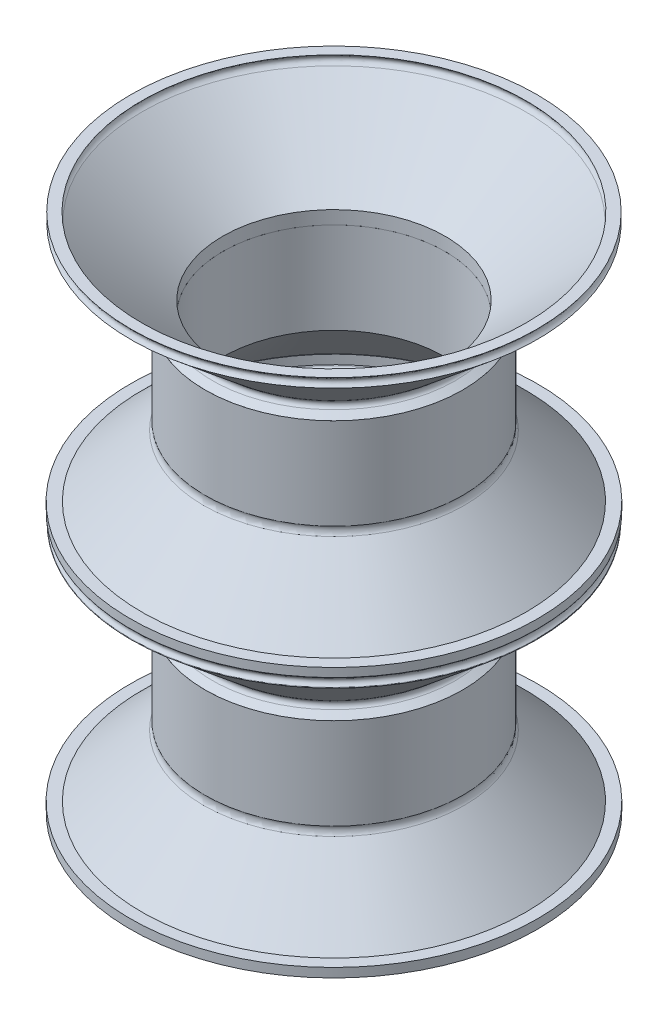
ISO-10303-21;
HEADER;
FILE_DESCRIPTION(('STEP AP214'),'2;1');
FILE_NAME('part.step','',(''),(''),'','','');
FILE_SCHEMA(('AUTOMOTIVE_DESIGN { 1 0 10303 214 1 1 1 1 }'));
ENDSEC;
DATA;
#1=APPLICATION_CONTEXT('core data for automotive mechanical design processes');
#2=APPLICATION_PROTOCOL_DEFINITION('international standard','automotive_design',2000,#1);
#3=PRODUCT_CONTEXT('',#1,'mechanical');
#4=PRODUCT('Part','Part','',(#3));
#5=PRODUCT_RELATED_PRODUCT_CATEGORY('part','',(#4));
#6=PRODUCT_DEFINITION_FORMATION('','',#4);
#7=PRODUCT_DEFINITION_CONTEXT('part definition',#1,'design');
#8=PRODUCT_DEFINITION('design','',#6,#7);
#9=PRODUCT_DEFINITION_SHAPE('','',#8);
#10=(LENGTH_UNIT() NAMED_UNIT(*) SI_UNIT(.MILLI.,.METRE.));
#11=(NAMED_UNIT(*) PLANE_ANGLE_UNIT() SI_UNIT($,.RADIAN.));
#12=(NAMED_UNIT(*) SI_UNIT($,.STERADIAN.) SOLID_ANGLE_UNIT());
#13=UNCERTAINTY_MEASURE_WITH_UNIT(LENGTH_MEASURE(1.E-05),#10,'distance_accuracy_value','');
#14=(GEOMETRIC_REPRESENTATION_CONTEXT(3) GLOBAL_UNCERTAINTY_ASSIGNED_CONTEXT((#13)) GLOBAL_UNIT_ASSIGNED_CONTEXT((#10,
#11,#12)) REPRESENTATION_CONTEXT('',''));
#15=CARTESIAN_POINT('',(0.,0.,0.));
#16=DIRECTION('',(0.,0.,1.));
#17=DIRECTION('',(1.,0.,0.));
#18=AXIS2_PLACEMENT_3D('',#15,#16,#17);
#19=CARTESIAN_POINT('',(12.266246150267,28.45,0.));
#20=DIRECTION('',(0.,-1.,0.));
#21=DIRECTION('',(1.,0.,0.));
#22=AXIS2_PLACEMENT_3D('',#19,#20,#21);
#23=CONICAL_SURFACE('',#22,12.7105503207346,1.02390555454664);
#24=CARTESIAN_POINT('',(12.266246150267,28.0877114557299,0.));
#25=DIRECTION('',(0.,-1.,0.));
#26=DIRECTION('',(1.,0.,0.));
#27=AXIS2_PLACEMENT_3D('',#24,#25,#26);
#28=CIRCLE('',#27,13.3056020683309);
#29=CARTESIAN_POINT('',(25.5718482185979,28.0877114557299,0.));
#30=VERTEX_POINT('',#29);
#31=EDGE_CURVE('E11',#30,#30,#28,.T.);
#32=ORIENTED_EDGE('',*,*,#31,.T.);
#33=EDGE_LOOP('',(#32));
#34=FACE_BOUND('',#33,.T.);
#35=CARTESIAN_POINT('',(12.266246150267,27.6018152658715,0.));
#36=DIRECTION('',(0.,1.,0.));
#37=DIRECTION('',(-1.,0.,0.));
#38=AXIS2_PLACEMENT_3D('',#35,#36,#37);
#39=CIRCLE('',#38,14.1036769219207);
#40=CARTESIAN_POINT('',(-1.83743077165368,27.6018152658715,0.));
#41=VERTEX_POINT('',#40);
#42=EDGE_CURVE('E75',#41,#41,#39,.T.);
#43=ORIENTED_EDGE('',*,*,#42,.T.);
#44=EDGE_LOOP('',(#43));
#45=FACE_BOUND('',#44,.T.);
#46=ADVANCED_FACE('F52',(#34,#45),#23,.T.);
#47=CARTESIAN_POINT('',(12.266246150267,36.45,0.));
#48=DIRECTION('',(0.,1.,0.));
#49=DIRECTION('',(-1.,0.,0.));
#50=AXIS2_PLACEMENT_3D('',#47,#48,#49);
#51=CONICAL_SURFACE('',#50,22.2445790614883,0.87266462599717);
#52=CARTESIAN_POINT('',(12.266246150267,28.8978064534284,0.));
#53=DIRECTION('',(0.,1.,0.));
#54=DIRECTION('',(-1.,0.,0.));
#55=AXIS2_PLACEMENT_3D('',#52,#53,#54);
#56=CIRCLE('',#55,13.2442252703947);
#57=CARTESIAN_POINT('',(-0.977979120127719,28.8978064534284,0.));
#58=VERTEX_POINT('',#57);
#59=EDGE_CURVE('E59',#58,#58,#56,.T.);
#60=ORIENTED_EDGE('',*,*,#59,.T.);
#61=EDGE_LOOP('',(#60));
#62=FACE_BOUND('',#61,.T.);
#63=CARTESIAN_POINT('',(12.266246150267,36.45,0.));
#64=DIRECTION('',(0.,1.,0.));
#65=DIRECTION('',(-1.,0.,0.));
#66=AXIS2_PLACEMENT_3D('',#63,#64,#65);
#67=CIRCLE('',#66,22.2445790614883);
#68=CARTESIAN_POINT('',(-9.97833291122136,36.45,0.));
#69=VERTEX_POINT('',#68);
#70=EDGE_CURVE('E63',#69,#69,#67,.T.);
#71=ORIENTED_EDGE('',*,*,#70,.F.);
#72=EDGE_LOOP('',(#71));
#73=FACE_BOUND('',#72,.T.);
#74=ADVANCED_FACE('F121',(#62,#73),#51,.T.);
#75=CARTESIAN_POINT('',(12.266246150267,29.0497502558786,0.));
#76=DIRECTION('',(0.,1.,0.));
#77=DIRECTION('',(-1.,0.,0.));
#78=AXIS2_PLACEMENT_3D('',#75,#76,#77);
#79=CONICAL_SURFACE('',#78,12.1807257813488,0.87266462599717);
#80=CARTESIAN_POINT('',(12.266246150267,36.45,0.));
#81=DIRECTION('',(0.,-1.,0.));
#82=DIRECTION('',(1.,0.,0.));
#83=AXIS2_PLACEMENT_3D('',#80,#81,#82);
#84=CIRCLE('',#83,21.);
#85=CARTESIAN_POINT('',(33.266246150267,36.45,0.));
#86=VERTEX_POINT('',#85);
#87=EDGE_CURVE('E84',#86,#86,#84,.T.);
#88=ORIENTED_EDGE('',*,*,#87,.F.);
#89=EDGE_LOOP('',(#88));
#90=FACE_BOUND('',#89,.T.);
#91=CARTESIAN_POINT('',(12.266246150267,29.0497502558786,0.));
#92=DIRECTION('',(0.,1.,0.));
#93=DIRECTION('',(-1.,0.,0.));
#94=AXIS2_PLACEMENT_3D('',#91,#92,#93);
#95=CIRCLE('',#94,12.1807257813488);
#96=CARTESIAN_POINT('',(0.0855203689181672,29.0497502558786,0.));
#97=VERTEX_POINT('',#96);
#98=EDGE_CURVE('E67',#97,#97,#95,.T.);
#99=ORIENTED_EDGE('',*,*,#98,.F.);
#100=EDGE_LOOP('',(#99));
#101=FACE_BOUND('',#100,.T.);
#102=ADVANCED_FACE('F117',(#90,#101),#79,.F.);
#103=CARTESIAN_POINT('',(12.266246150267,36.0590180328199,0.));
#104=DIRECTION('',(0.,1.,0.));
#105=DIRECTION('',(-1.,0.,0.));
#106=AXIS2_PLACEMENT_3D('',#103,#104,#105);
#107=CYLINDRICAL_SURFACE('',#106,12.1807257813488);
#108=ORIENTED_EDGE('',*,*,#98,.T.);
#109=EDGE_LOOP('',(#108));
#110=FACE_BOUND('',#109,.T.);
#111=CARTESIAN_POINT('',(12.266246150267,27.6018152658715,0.));
#112=DIRECTION('',(0.,1.,0.));
#113=DIRECTION('',(-1.,0.,0.));
#114=AXIS2_PLACEMENT_3D('',#111,#112,#113);
#115=CIRCLE('',#114,12.1807257813488);
#116=CARTESIAN_POINT('',(0.0855203689181672,27.6018152658715,0.));
#117=VERTEX_POINT('',#116);
#118=EDGE_CURVE('E72',#117,#117,#115,.T.);
#119=ORIENTED_EDGE('',*,*,#118,.F.);
#120=EDGE_LOOP('',(#119));
#121=FACE_BOUND('',#120,.T.);
#122=ADVANCED_FACE('F113',(#110,#121),#107,.F.);
#123=CARTESIAN_POINT('',(0.0855203689181681,27.6018152658715,0.));
#124=DIRECTION('',(0.,-1.,0.));
#125=DIRECTION('',(1.,0.,0.));
#126=AXIS2_PLACEMENT_3D('',#123,#124,#125);
#127=PLANE('',#126);
#128=ORIENTED_EDGE('',*,*,#118,.T.);
#129=EDGE_LOOP('',(#128));
#130=FACE_BOUND('',#129,.T.);
#131=ORIENTED_EDGE('',*,*,#42,.F.);
#132=EDGE_LOOP('',(#131));
#133=FACE_BOUND('',#132,.T.);
#134=ADVANCED_FACE('F110',(#130,#133),#127,.T.);
#135=CARTESIAN_POINT('',(12.266246150267,28.5147842318689,0.));
#136=DIRECTION('',(0.,1.,0.));
#137=DIRECTION('',(-1.,0.,0.));
#138=AXIS2_PLACEMENT_3D('',#135,#136,#137);
#139=TOROIDAL_SURFACE('',#138,13.565619075238,0.5);
#140=ORIENTED_EDGE('',*,*,#31,.F.);
#141=EDGE_LOOP('',(#140));
#142=FACE_BOUND('',#141,.T.);
#143=ORIENTED_EDGE('',*,*,#59,.F.);
#144=EDGE_LOOP('',(#143));
#145=FACE_BOUND('',#144,.T.);
#146=ADVANCED_FACE('F54',(#142,#145),#139,.F.);
#147=CARTESIAN_POINT('',(-8.73375384973302,36.45,0.));
#148=CARTESIAN_POINT('',(-9.41713424360817,36.9047580248928,0.));
#149=CARTESIAN_POINT('',(-8.79657882871846,37.45,0.));
#150=B_SPLINE_CURVE_WITH_KNOTS('',2,(#147,#148,#149),.UNSPECIFIED.,.F.,.F.,(3,3),(0.,1.),.UNSPECIFIED.);
#151=CARTESIAN_POINT('',(12.266246150267,8.48015566974782,0.));
#152=DIRECTION('',(0.,-1.,0.));
#153=AXIS1_PLACEMENT('',#151,#152);
#154=SURFACE_OF_REVOLUTION('',#150,#153);
#155=CARTESIAN_POINT('',(12.266246150267,37.45,0.));
#156=DIRECTION('',(0.,-1.,0.));
#157=DIRECTION('',(1.,0.,0.));
#158=AXIS2_PLACEMENT_3D('',#155,#156,#157);
#159=CIRCLE('',#158,21.0628249789854);
#160=CARTESIAN_POINT('',(33.3290711292524,37.45,0.));
#161=VERTEX_POINT('',#160);
#162=EDGE_CURVE('E78',#161,#161,#159,.T.);
#163=ORIENTED_EDGE('',*,*,#162,.F.);
#164=EDGE_LOOP('',(#163));
#165=FACE_BOUND('',#164,.T.);
#166=ORIENTED_EDGE('',*,*,#87,.T.);
#167=EDGE_LOOP('',(#166));
#168=FACE_BOUND('',#167,.T.);
#169=ADVANCED_FACE('F105',(#165,#168),#154,.T.);
#170=CARTESIAN_POINT('',(-8.79657882871846,37.45,0.));
#171=DIRECTION('',(0.,-1.,0.));
#172=DIRECTION('',(1.,0.,0.));
#173=AXIS2_PLACEMENT_3D('',#170,#171,#172);
#174=PLANE('',#173);
#175=CARTESIAN_POINT('',(12.266246150267,37.45,0.));
#176=DIRECTION('',(0.,-1.,0.));
#177=DIRECTION('',(1.,0.,0.));
#178=AXIS2_PLACEMENT_3D('',#175,#176,#177);
#179=CIRCLE('',#178,22.2445790614883);
#180=CARTESIAN_POINT('',(34.5108252117553,37.45,0.));
#181=VERTEX_POINT('',#180);
#182=EDGE_CURVE('E81',#181,#181,#179,.T.);
#183=ORIENTED_EDGE('',*,*,#182,.F.);
#184=EDGE_LOOP('',(#183));
#185=FACE_BOUND('',#184,.T.);
#186=ORIENTED_EDGE('',*,*,#162,.T.);
#187=EDGE_LOOP('',(#186));
#188=FACE_BOUND('',#187,.T.);
#189=ADVANCED_FACE('F101',(#185,#188),#174,.F.);
#190=CARTESIAN_POINT('',(-9.97833291122136,37.45,0.));
#191=CARTESIAN_POINT('',(-9.32229251414753,36.9333569168223,0.));
#192=CARTESIAN_POINT('',(-9.97833291122136,36.45,0.));
#193=B_SPLINE_CURVE_WITH_KNOTS('',2,(#190,#191,#192),.UNSPECIFIED.,.F.,.F.,(3,3),(0.,1.),.UNSPECIFIED.);
#194=CARTESIAN_POINT('',(12.266246150267,8.48015566974782,0.));
#195=DIRECTION('',(0.,-1.,0.));
#196=AXIS1_PLACEMENT('',#194,#195);
#197=SURFACE_OF_REVOLUTION('',#193,#196);
#198=ORIENTED_EDGE('',*,*,#70,.T.);
#199=EDGE_LOOP('',(#198));
#200=FACE_BOUND('',#199,.T.);
#201=ORIENTED_EDGE('',*,*,#182,.T.);
#202=EDGE_LOOP('',(#201));
#203=FACE_BOUND('',#202,.T.);
#204=ADVANCED_FACE('F98',(#200,#203),#197,.T.);
#205=CLOSED_SHELL('',(#46,#74,#102,#122,#134,#146,#169,#189,#204));
#206=MANIFOLD_SOLID_BREP('B2',#205);
#207=CARTESIAN_POINT('',(12.266246150267,27.6018152658715,0.));
#208=DIRECTION('',(0.,-1.,0.));
#209=DIRECTION('',(1.,0.,0.));
#210=AXIS2_PLACEMENT_3D('',#207,#208,#209);
#211=PLANE('',#210);
#212=CARTESIAN_POINT('',(12.266246150267,27.6018152658715,0.));
#213=DIRECTION('',(0.,-1.,0.));
#214=DIRECTION('',(1.,0.,0.));
#215=AXIS2_PLACEMENT_3D('',#212,#213,#214);
#216=CIRCLE('',#215,14.1036769219207);
#217=CARTESIAN_POINT('',(26.3699230721876,27.6018152658715,0.));
#218=VERTEX_POINT('',#217);
#219=EDGE_CURVE('E229',#218,#218,#216,.T.);
#220=ORIENTED_EDGE('',*,*,#219,.F.);
#221=EDGE_LOOP('',(#220));
#222=FACE_BOUND('',#221,.T.);
#223=CARTESIAN_POINT('',(12.266246150267,27.6018152658715,0.));
#224=DIRECTION('',(0.,-1.,0.));
#225=DIRECTION('',(1.,0.,0.));
#226=AXIS2_PLACEMENT_3D('',#223,#224,#225);
#227=CIRCLE('',#226,12.1807257813488);
#228=CARTESIAN_POINT('',(24.4469719316158,27.6018152658715,0.));
#229=VERTEX_POINT('',#228);
#230=EDGE_CURVE('E232',#229,#229,#227,.T.);
#231=ORIENTED_EDGE('',*,*,#230,.T.);
#232=EDGE_LOOP('',(#231));
#233=FACE_BOUND('',#232,.T.);
#234=ADVANCED_FACE('F211',(#222,#233),#211,.F.);
#235=CARTESIAN_POINT('',(12.266246150267,17.6018152658715,0.));
#236=DIRECTION('',(0.,1.,0.));
#237=DIRECTION('',(-1.,0.,0.));
#238=AXIS2_PLACEMENT_3D('',#235,#236,#237);
#239=CYLINDRICAL_SURFACE('',#238,14.1036769219207);
#240=CARTESIAN_POINT('',(12.266246150267,17.6018152658715,0.));
#241=DIRECTION('',(0.,-1.,0.));
#242=DIRECTION('',(1.,0.,0.));
#243=AXIS2_PLACEMENT_3D('',#240,#241,#242);
#244=CIRCLE('',#243,14.1036769219207);
#245=CARTESIAN_POINT('',(26.3699230721876,17.6018152658715,0.));
#246=VERTEX_POINT('',#245);
#247=EDGE_CURVE('E226',#246,#246,#244,.T.);
#248=ORIENTED_EDGE('',*,*,#247,.F.);
#249=EDGE_LOOP('',(#248));
#250=FACE_BOUND('',#249,.T.);
#251=ORIENTED_EDGE('',*,*,#219,.T.);
#252=EDGE_LOOP('',(#251));
#253=FACE_BOUND('',#252,.T.);
#254=ADVANCED_FACE('F277',(#250,#253),#239,.T.);
#255=CARTESIAN_POINT('',(12.266246150267,17.6018152658715,0.));
#256=DIRECTION('',(0.,1.,0.));
#257=DIRECTION('',(-1.,0.,0.));
#258=AXIS2_PLACEMENT_3D('',#255,#256,#257);
#259=CYLINDRICAL_SURFACE('',#258,12.1807257813488);
#260=CARTESIAN_POINT('',(12.266246150267,17.6018152658715,0.));
#261=DIRECTION('',(0.,-1.,0.));
#262=DIRECTION('',(1.,0.,0.));
#263=AXIS2_PLACEMENT_3D('',#260,#261,#262);
#264=CIRCLE('',#263,12.1807257813488);
#265=CARTESIAN_POINT('',(24.4469719316158,17.6018152658715,0.));
#266=VERTEX_POINT('',#265);
#267=EDGE_CURVE('E240',#266,#266,#264,.T.);
#268=ORIENTED_EDGE('',*,*,#267,.T.);
#269=EDGE_LOOP('',(#268));
#270=FACE_BOUND('',#269,.T.);
#271=ORIENTED_EDGE('',*,*,#230,.F.);
#272=EDGE_LOOP('',(#271));
#273=FACE_BOUND('',#272,.T.);
#274=ADVANCED_FACE('F283',(#270,#273),#259,.F.);
#275=CARTESIAN_POINT('',(12.266246150267,17.6018152658715,0.));
#276=DIRECTION('',(0.,-1.,0.));
#277=DIRECTION('',(1.,0.,0.));
#278=AXIS2_PLACEMENT_3D('',#275,#276,#277);
#279=CONICAL_SURFACE('',#278,13.4252337162371,0.785398163397447);
#280=CARTESIAN_POINT('',(12.266246150267,16.7442172194325,0.));
#281=DIRECTION('',(0.,1.,0.));
#282=DIRECTION('',(-1.,0.,0.));
#283=AXIS2_PLACEMENT_3D('',#280,#281,#282);
#284=CIRCLE('',#283,14.2828317626761);
#285=CARTESIAN_POINT('',(-2.01658561240909,16.7442172194325,0.));
#286=VERTEX_POINT('',#285);
#287=EDGE_CURVE('E222',#286,#286,#284,.F.);
#288=ORIENTED_EDGE('',*,*,#287,.T.);
#289=EDGE_LOOP('',(#288));
#290=FACE_BOUND('',#289,.T.);
#291=CARTESIAN_POINT('',(12.266246150267,9.99443833530415,0.));
#292=DIRECTION('',(0.,-1.,0.));
#293=DIRECTION('',(1.,0.,0.));
#294=AXIS2_PLACEMENT_3D('',#291,#292,#293);
#295=CIRCLE('',#294,21.0326106468044);
#296=CARTESIAN_POINT('',(33.2988567970714,9.99443833530415,0.));
#297=VERTEX_POINT('',#296);
#298=EDGE_CURVE('E237',#297,#297,#295,.T.);
#299=ORIENTED_EDGE('',*,*,#298,.F.);
#300=EDGE_LOOP('',(#299));
#301=FACE_BOUND('',#300,.T.);
#302=ADVANCED_FACE('F296',(#290,#301),#279,.T.);
#303=CARTESIAN_POINT('',(12.266246150267,9.99443833530414,0.));
#304=DIRECTION('',(0.,-1.,0.));
#305=DIRECTION('',(1.,0.,0.));
#306=AXIS2_PLACEMENT_3D('',#303,#304,#305);
#307=CONICAL_SURFACE('',#306,19.7881027119161,0.785398163397446);
#308=ORIENTED_EDGE('',*,*,#267,.F.);
#309=EDGE_LOOP('',(#308));
#310=FACE_BOUND('',#309,.T.);
#311=CARTESIAN_POINT('',(12.266246150267,9.99443833530414,0.));
#312=DIRECTION('',(0.,-1.,0.));
#313=DIRECTION('',(1.,0.,0.));
#314=AXIS2_PLACEMENT_3D('',#311,#312,#313);
#315=CIRCLE('',#314,19.7881027119161);
#316=CARTESIAN_POINT('',(32.0543488621831,9.99443833530415,0.));
#317=VERTEX_POINT('',#316);
#318=EDGE_CURVE('E241',#317,#317,#315,.T.);
#319=ORIENTED_EDGE('',*,*,#318,.T.);
#320=EDGE_LOOP('',(#319));
#321=FACE_BOUND('',#320,.T.);
#322=ADVANCED_FACE('F291',(#310,#321),#307,.F.);
#323=CARTESIAN_POINT('',(12.266246150267,17.3099026443818,0.));
#324=DIRECTION('',(0.,1.,0.));
#325=DIRECTION('',(-1.,0.,0.));
#326=AXIS2_PLACEMENT_3D('',#323,#324,#325);
#327=TOROIDAL_SURFACE('',#326,14.8485171876253,0.8);
#328=ORIENTED_EDGE('',*,*,#247,.T.);
#329=EDGE_LOOP('',(#328));
#330=FACE_BOUND('',#329,.T.);
#331=ORIENTED_EDGE('',*,*,#287,.F.);
#332=EDGE_LOOP('',(#331));
#333=FACE_BOUND('',#332,.T.);
#334=ADVANCED_FACE('F273',(#330,#333),#327,.F.);
#335=CARTESIAN_POINT('',(12.266246150267,9.99443833530414,0.));
#336=DIRECTION('',(0.,-1.,0.));
#337=DIRECTION('',(1.,0.,0.));
#338=AXIS2_PLACEMENT_3D('',#335,#336,#337);
#339=PLANE('',#338);
#340=CARTESIAN_POINT('',(12.266246150267,9.99443833530414,0.));
#341=DIRECTION('',(0.,-1.,0.));
#342=DIRECTION('',(1.,0.,0.));
#343=AXIS2_PLACEMENT_3D('',#340,#341,#342);
#344=CIRCLE('',#343,19.7381027119161);
#345=CARTESIAN_POINT('',(32.0043488621831,9.99443833530415,0.));
#346=VERTEX_POINT('',#345);
#347=EDGE_CURVE('E250',#346,#346,#344,.T.);
#348=ORIENTED_EDGE('',*,*,#347,.T.);
#349=EDGE_LOOP('',(#348));
#350=FACE_BOUND('',#349,.T.);
#351=ORIENTED_EDGE('',*,*,#318,.F.);
#352=EDGE_LOOP('',(#351));
#353=FACE_BOUND('',#352,.T.);
#354=ADVANCED_FACE('F262',(#350,#353),#339,.F.);
#355=CARTESIAN_POINT('',(12.266246150267,8.99443833530414,0.));
#356=DIRECTION('',(0.,-1.,0.));
#357=DIRECTION('',(1.,0.,0.));
#358=AXIS2_PLACEMENT_3D('',#355,#356,#357);
#359=PLANE('',#358);
#360=CARTESIAN_POINT('',(12.266246150267,8.99443833530414,0.));
#361=DIRECTION('',(0.,-1.,0.));
#362=DIRECTION('',(1.,0.,0.));
#363=AXIS2_PLACEMENT_3D('',#360,#361,#362);
#364=CIRCLE('',#363,22.2445790614883);
#365=CARTESIAN_POINT('',(34.5108252117553,8.99443833530415,0.));
#366=VERTEX_POINT('',#365);
#367=EDGE_CURVE('E218',#366,#366,#364,.T.);
#368=ORIENTED_EDGE('',*,*,#367,.T.);
#369=EDGE_LOOP('',(#368));
#370=FACE_BOUND('',#369,.T.);
#371=CARTESIAN_POINT('',(12.266246150267,8.99443833530414,0.));
#372=DIRECTION('',(0.,-1.,0.));
#373=DIRECTION('',(1.,0.,0.));
#374=AXIS2_PLACEMENT_3D('',#371,#372,#373);
#375=CIRCLE('',#374,19.7381027119161);
#376=CARTESIAN_POINT('',(32.0043488621831,8.99443833530414,0.));
#377=VERTEX_POINT('',#376);
#378=EDGE_CURVE('E249',#377,#377,#375,.T.);
#379=ORIENTED_EDGE('',*,*,#378,.F.);
#380=EDGE_LOOP('',(#379));
#381=FACE_BOUND('',#380,.T.);
#382=ADVANCED_FACE('F259',(#370,#381),#359,.T.);
#383=ORIENTED_EDGE('',*,*,#298,.T.);
#384=EDGE_LOOP('',(#383));
#385=FACE_BOUND('',#384,.T.);
#386=CARTESIAN_POINT('',(12.266246150267,9.99443833530414,0.));
#387=DIRECTION('',(0.,-1.,0.));
#388=DIRECTION('',(1.,0.,0.));
#389=AXIS2_PLACEMENT_3D('',#386,#387,#388);
#390=CIRCLE('',#389,22.2945790614883);
#391=CARTESIAN_POINT('',(34.5608252117553,9.99443833530415,0.));
#392=VERTEX_POINT('',#391);
#393=EDGE_CURVE('E244',#392,#392,#390,.T.);
#394=ORIENTED_EDGE('',*,*,#393,.F.);
#395=EDGE_LOOP('',(#394));
#396=FACE_BOUND('',#395,.T.);
#397=ADVANCED_FACE('F261',(#385,#396),#339,.F.);
#398=CARTESIAN_POINT('',(12.266246150267,8.99443833530414,0.));
#399=DIRECTION('',(0.,1.,0.));
#400=DIRECTION('',(-1.,0.,0.));
#401=AXIS2_PLACEMENT_3D('',#398,#399,#400);
#402=CYLINDRICAL_SURFACE('',#401,22.2945790614883);
#403=CARTESIAN_POINT('',(12.266246150267,9.04443833530414,0.));
#404=DIRECTION('',(0.,-1.,0.));
#405=DIRECTION('',(1.,0.,0.));
#406=AXIS2_PLACEMENT_3D('',#403,#404,#405);
#407=CIRCLE('',#406,22.2945790614883);
#408=CARTESIAN_POINT('',(34.5608252117553,9.04443833530414,0.));
#409=VERTEX_POINT('',#408);
#410=EDGE_CURVE('E51',#409,#409,#407,.F.);
#411=ORIENTED_EDGE('',*,*,#410,.T.);
#412=EDGE_LOOP('',(#411));
#413=FACE_BOUND('',#412,.T.);
#414=ORIENTED_EDGE('',*,*,#393,.T.);
#415=EDGE_LOOP('',(#414));
#416=FACE_BOUND('',#415,.T.);
#417=ADVANCED_FACE('F269',(#413,#416),#402,.T.);
#418=CARTESIAN_POINT('',(12.266246150267,8.99443833530414,0.));
#419=DIRECTION('',(0.,1.,0.));
#420=DIRECTION('',(-1.,0.,0.));
#421=AXIS2_PLACEMENT_3D('',#418,#419,#420);
#422=CYLINDRICAL_SURFACE('',#421,19.7381027119161);
#423=ORIENTED_EDGE('',*,*,#378,.T.);
#424=EDGE_LOOP('',(#423));
#425=FACE_BOUND('',#424,.T.);
#426=ORIENTED_EDGE('',*,*,#347,.F.);
#427=EDGE_LOOP('',(#426));
#428=FACE_BOUND('',#427,.T.);
#429=ADVANCED_FACE('F256',(#425,#428),#422,.F.);
#430=CARTESIAN_POINT('',(12.266246150267,9.04443833530414,0.));
#431=DIRECTION('',(0.,-1.,0.));
#432=DIRECTION('',(1.,0.,0.));
#433=AXIS2_PLACEMENT_3D('',#430,#431,#432);
#434=TOROIDAL_SURFACE('',#433,22.2445790614883,0.05);
#435=ORIENTED_EDGE('',*,*,#410,.F.);
#436=EDGE_LOOP('',(#435));
#437=FACE_BOUND('',#436,.T.);
#438=ORIENTED_EDGE('',*,*,#367,.F.);
#439=EDGE_LOOP('',(#438));
#440=FACE_BOUND('',#439,.T.);
#441=ADVANCED_FACE('F213',(#437,#440),#434,.T.);
#442=CLOSED_SHELL('',(#234,#254,#274,#302,#322,#334,#354,#382,#397,#417,#429,#441));
#443=MANIFOLD_SOLID_BREP('B6',#442);
#444=CARTESIAN_POINT('',(12.266246150267,-0.84818473412852,0.));
#445=DIRECTION('',(0.,-1.,0.));
#446=DIRECTION('',(1.,0.,0.));
#447=AXIS2_PLACEMENT_3D('',#444,#445,#446);
#448=PLANE('',#447);
#449=CARTESIAN_POINT('',(12.266246150267,-0.84818473412852,0.));
#450=DIRECTION('',(0.,-1.,0.));
#451=DIRECTION('',(1.,0.,0.));
#452=AXIS2_PLACEMENT_3D('',#449,#450,#451);
#453=CIRCLE('',#452,14.1036769219207);
#454=CARTESIAN_POINT('',(26.3699230721876,-0.848184734128518,0.));
#455=VERTEX_POINT('',#454);
#456=EDGE_CURVE('E410',#455,#455,#453,.T.);
#457=ORIENTED_EDGE('',*,*,#456,.F.);
#458=EDGE_LOOP('',(#457));
#459=FACE_BOUND('',#458,.T.);
#460=CARTESIAN_POINT('',(12.266246150267,-0.84818473412852,0.));
#461=DIRECTION('',(0.,-1.,0.));
#462=DIRECTION('',(1.,0.,0.));
#463=AXIS2_PLACEMENT_3D('',#460,#461,#462);
#464=CIRCLE('',#463,12.1807257813488);
#465=CARTESIAN_POINT('',(24.4469719316158,-0.848184734128518,0.));
#466=VERTEX_POINT('',#465);
#467=EDGE_CURVE('E415',#466,#466,#464,.T.);
#468=ORIENTED_EDGE('',*,*,#467,.T.);
#469=EDGE_LOOP('',(#468));
#470=FACE_BOUND('',#469,.T.);
#471=ADVANCED_FACE('F399',(#459,#470),#448,.F.);
#472=CARTESIAN_POINT('',(12.266246150267,-10.8481847341285,0.));
#473=DIRECTION('',(0.,1.,0.));
#474=DIRECTION('',(-1.,0.,0.));
#475=AXIS2_PLACEMENT_3D('',#472,#473,#474);
#476=CYLINDRICAL_SURFACE('',#475,14.1036769219207);
#477=CARTESIAN_POINT('',(12.266246150267,-10.8481847341285,0.));
#478=DIRECTION('',(0.,-1.,0.));
#479=DIRECTION('',(1.,0.,0.));
#480=AXIS2_PLACEMENT_3D('',#477,#478,#479);
#481=CIRCLE('',#480,14.1036769219207);
#482=CARTESIAN_POINT('',(26.3699230721876,-10.8481847341285,0.));
#483=VERTEX_POINT('',#482);
#484=EDGE_CURVE('E406',#483,#483,#481,.T.);
#485=ORIENTED_EDGE('',*,*,#484,.F.);
#486=EDGE_LOOP('',(#485));
#487=FACE_BOUND('',#486,.T.);
#488=ORIENTED_EDGE('',*,*,#456,.T.);
#489=EDGE_LOOP('',(#488));
#490=FACE_BOUND('',#489,.T.);
#491=ADVANCED_FACE('F460',(#487,#490),#476,.T.);
#492=CARTESIAN_POINT('',(12.266246150267,-10.8481847341285,0.));
#493=DIRECTION('',(0.,1.,0.));
#494=DIRECTION('',(-1.,0.,0.));
#495=AXIS2_PLACEMENT_3D('',#492,#493,#494);
#496=CYLINDRICAL_SURFACE('',#495,12.1807257813488);
#497=CARTESIAN_POINT('',(12.266246150267,-10.8481847341285,0.));
#498=DIRECTION('',(0.,-1.,0.));
#499=DIRECTION('',(1.,0.,0.));
#500=AXIS2_PLACEMENT_3D('',#497,#498,#499);
#501=CIRCLE('',#500,12.1807257813488);
#502=CARTESIAN_POINT('',(24.4469719316158,-10.8481847341285,0.));
#503=VERTEX_POINT('',#502);
#504=EDGE_CURVE('E422',#503,#503,#501,.T.);
#505=ORIENTED_EDGE('',*,*,#504,.T.);
#506=EDGE_LOOP('',(#505));
#507=FACE_BOUND('',#506,.T.);
#508=ORIENTED_EDGE('',*,*,#467,.F.);
#509=EDGE_LOOP('',(#508));
#510=FACE_BOUND('',#509,.T.);
#511=ADVANCED_FACE('F466',(#507,#510),#496,.F.);
#512=CARTESIAN_POINT('',(12.266246150267,-10.8481847341285,0.));
#513=DIRECTION('',(0.,-1.,0.));
#514=DIRECTION('',(1.,0.,0.));
#515=AXIS2_PLACEMENT_3D('',#512,#513,#514);
#516=CONICAL_SURFACE('',#515,13.4252337162371,0.785398163397447);
#517=CARTESIAN_POINT('',(12.266246150267,-11.7057827805675,0.));
#518=DIRECTION('',(0.,1.,0.));
#519=DIRECTION('',(-1.,0.,0.));
#520=AXIS2_PLACEMENT_3D('',#517,#518,#519);
#521=CIRCLE('',#520,14.2828317626761);
#522=CARTESIAN_POINT('',(-2.01658561240909,-11.7057827805675,0.));
#523=VERTEX_POINT('',#522);
#524=EDGE_CURVE('E210',#523,#523,#521,.F.);
#525=ORIENTED_EDGE('',*,*,#524,.T.);
#526=EDGE_LOOP('',(#525));
#527=FACE_BOUND('',#526,.T.);
#528=CARTESIAN_POINT('',(12.266246150267,-18.4555616646959,0.));
#529=DIRECTION('',(0.,-1.,0.));
#530=DIRECTION('',(1.,0.,0.));
#531=AXIS2_PLACEMENT_3D('',#528,#529,#530);
#532=CIRCLE('',#531,21.0326106468044);
#533=CARTESIAN_POINT('',(33.2988567970714,-18.4555616646958,0.));
#534=VERTEX_POINT('',#533);
#535=EDGE_CURVE('E419',#534,#534,#532,.T.);
#536=ORIENTED_EDGE('',*,*,#535,.F.);
#537=EDGE_LOOP('',(#536));
#538=FACE_BOUND('',#537,.T.);
#539=ADVANCED_FACE('F473',(#527,#538),#516,.T.);
#540=CARTESIAN_POINT('',(12.266246150267,-18.4555616646959,0.));
#541=DIRECTION('',(0.,-1.,0.));
#542=DIRECTION('',(1.,0.,0.));
#543=AXIS2_PLACEMENT_3D('',#540,#541,#542);
#544=CONICAL_SURFACE('',#543,19.7881027119161,0.785398163397446);
#545=ORIENTED_EDGE('',*,*,#504,.F.);
#546=EDGE_LOOP('',(#545));
#547=FACE_BOUND('',#546,.T.);
#548=CARTESIAN_POINT('',(12.266246150267,-18.4555616646959,0.));
#549=DIRECTION('',(0.,-1.,0.));
#550=DIRECTION('',(1.,0.,0.));
#551=AXIS2_PLACEMENT_3D('',#548,#549,#550);
#552=CIRCLE('',#551,19.7881027119161);
#553=CARTESIAN_POINT('',(32.0543488621831,-18.4555616646959,0.));
#554=VERTEX_POINT('',#553);
#555=EDGE_CURVE('E423',#554,#554,#552,.T.);
#556=ORIENTED_EDGE('',*,*,#555,.T.);
#557=EDGE_LOOP('',(#556));
#558=FACE_BOUND('',#557,.T.);
#559=ADVANCED_FACE('F477',(#547,#558),#544,.F.);
#560=CARTESIAN_POINT('',(12.266246150267,-11.1400973556182,0.));
#561=DIRECTION('',(0.,1.,0.));
#562=DIRECTION('',(-1.,0.,0.));
#563=AXIS2_PLACEMENT_3D('',#560,#561,#562);
#564=TOROIDAL_SURFACE('',#563,14.8485171876253,0.8);
#565=ORIENTED_EDGE('',*,*,#484,.T.);
#566=EDGE_LOOP('',(#565));
#567=FACE_BOUND('',#566,.T.);
#568=ORIENTED_EDGE('',*,*,#524,.F.);
#569=EDGE_LOOP('',(#568));
#570=FACE_BOUND('',#569,.T.);
#571=ADVANCED_FACE('F401',(#567,#570),#564,.F.);
#572=CARTESIAN_POINT('',(12.266246150267,-18.4555616646959,0.));
#573=DIRECTION('',(0.,-1.,0.));
#574=DIRECTION('',(1.,0.,0.));
#575=AXIS2_PLACEMENT_3D('',#572,#573,#574);
#576=PLANE('',#575);
#577=CARTESIAN_POINT('',(12.266246150267,-18.4555616646959,0.));
#578=DIRECTION('',(0.,-1.,0.));
#579=DIRECTION('',(1.,0.,0.));
#580=AXIS2_PLACEMENT_3D('',#577,#578,#579);
#581=CIRCLE('',#580,19.7381027119161);
#582=CARTESIAN_POINT('',(32.0043488621831,-18.4555616646959,0.));
#583=VERTEX_POINT('',#582);
#584=EDGE_CURVE('E435',#583,#583,#581,.T.);
#585=ORIENTED_EDGE('',*,*,#584,.T.);
#586=EDGE_LOOP('',(#585));
#587=FACE_BOUND('',#586,.T.);
#588=ORIENTED_EDGE('',*,*,#555,.F.);
#589=EDGE_LOOP('',(#588));
#590=FACE_BOUND('',#589,.T.);
#591=ADVANCED_FACE('F447',(#587,#590),#576,.F.);
#592=CARTESIAN_POINT('',(12.266246150267,-19.4555616646959,0.));
#593=DIRECTION('',(0.,-1.,0.));
#594=DIRECTION('',(1.,0.,0.));
#595=AXIS2_PLACEMENT_3D('',#592,#593,#594);
#596=PLANE('',#595);
#597=CARTESIAN_POINT('',(12.266246150267,-19.4555616646959,0.));
#598=DIRECTION('',(0.,-1.,0.));
#599=DIRECTION('',(1.,0.,0.));
#600=AXIS2_PLACEMENT_3D('',#597,#598,#599);
#601=CIRCLE('',#600,22.2945790614883);
#602=CARTESIAN_POINT('',(34.5608252117553,-19.4555616646959,0.));
#603=VERTEX_POINT('',#602);
#604=EDGE_CURVE('E426',#603,#603,#601,.T.);
#605=ORIENTED_EDGE('',*,*,#604,.T.);
#606=EDGE_LOOP('',(#605));
#607=FACE_BOUND('',#606,.T.);
#608=CARTESIAN_POINT('',(12.266246150267,-19.4555616646959,0.));
#609=DIRECTION('',(0.,-1.,0.));
#610=DIRECTION('',(1.,0.,0.));
#611=AXIS2_PLACEMENT_3D('',#608,#609,#610);
#612=CIRCLE('',#611,19.7381027119161);
#613=CARTESIAN_POINT('',(32.0043488621831,-19.4555616646959,0.));
#614=VERTEX_POINT('',#613);
#615=EDGE_CURVE('E432',#614,#614,#612,.T.);
#616=ORIENTED_EDGE('',*,*,#615,.F.);
#617=EDGE_LOOP('',(#616));
#618=FACE_BOUND('',#617,.T.);
#619=ADVANCED_FACE('F444',(#607,#618),#596,.T.);
#620=ORIENTED_EDGE('',*,*,#535,.T.);
#621=EDGE_LOOP('',(#620));
#622=FACE_BOUND('',#621,.T.);
#623=CARTESIAN_POINT('',(12.266246150267,-18.4555616646959,0.));
#624=DIRECTION('',(0.,-1.,0.));
#625=DIRECTION('',(1.,0.,0.));
#626=AXIS2_PLACEMENT_3D('',#623,#624,#625);
#627=CIRCLE('',#626,22.2945790614883);
#628=CARTESIAN_POINT('',(34.5608252117553,-18.4555616646959,0.));
#629=VERTEX_POINT('',#628);
#630=EDGE_CURVE('E429',#629,#629,#627,.T.);
#631=ORIENTED_EDGE('',*,*,#630,.F.);
#632=EDGE_LOOP('',(#631));
#633=FACE_BOUND('',#632,.T.);
#634=ADVANCED_FACE('F446',(#622,#633),#576,.F.);
#635=CARTESIAN_POINT('',(12.266246150267,-19.4555616646959,0.));
#636=DIRECTION('',(0.,1.,0.));
#637=DIRECTION('',(-1.,0.,0.));
#638=AXIS2_PLACEMENT_3D('',#635,#636,#637);
#639=CYLINDRICAL_SURFACE('',#638,22.2945790614883);
#640=ORIENTED_EDGE('',*,*,#604,.F.);
#641=EDGE_LOOP('',(#640));
#642=FACE_BOUND('',#641,.T.);
#643=ORIENTED_EDGE('',*,*,#630,.T.);
#644=EDGE_LOOP('',(#643));
#645=FACE_BOUND('',#644,.T.);
#646=ADVANCED_FACE('F454',(#642,#645),#639,.T.);
#647=CARTESIAN_POINT('',(12.266246150267,-19.4555616646959,0.));
#648=DIRECTION('',(0.,1.,0.));
#649=DIRECTION('',(-1.,0.,0.));
#650=AXIS2_PLACEMENT_3D('',#647,#648,#649);
#651=CYLINDRICAL_SURFACE('',#650,19.7381027119161);
#652=ORIENTED_EDGE('',*,*,#615,.T.);
#653=EDGE_LOOP('',(#652));
#654=FACE_BOUND('',#653,.T.);
#655=ORIENTED_EDGE('',*,*,#584,.F.);
#656=EDGE_LOOP('',(#655));
#657=FACE_BOUND('',#656,.T.);
#658=ADVANCED_FACE('F441',(#654,#657),#651,.F.);
#659=CLOSED_SHELL('',(#471,#491,#511,#539,#559,#571,#591,#619,#634,#646,#658));
#660=MANIFOLD_SOLID_BREP('B46',#659);
#661=CARTESIAN_POINT('',(12.266246150267,0.,0.));
#662=DIRECTION('',(0.,-1.,0.));
#663=DIRECTION('',(1.,0.,0.));
#664=AXIS2_PLACEMENT_3D('',#661,#662,#663);
#665=CONICAL_SURFACE('',#664,12.7105503207346,1.02390555454664);
#666=CARTESIAN_POINT('',(12.266246150267,-0.362288544270145,0.));
#667=DIRECTION('',(0.,-1.,0.));
#668=DIRECTION('',(1.,0.,0.));
#669=AXIS2_PLACEMENT_3D('',#666,#667,#668);
#670=CIRCLE('',#669,13.3056020683309);
#671=CARTESIAN_POINT('',(25.5718482185979,-0.362288544270144,0.));
#672=VERTEX_POINT('',#671);
#673=EDGE_CURVE('E576',#672,#672,#670,.T.);
#674=ORIENTED_EDGE('',*,*,#673,.T.);
#675=EDGE_LOOP('',(#674));
#676=FACE_BOUND('',#675,.T.);
#677=CARTESIAN_POINT('',(12.266246150267,-0.848184734128519,0.));
#678=DIRECTION('',(0.,1.,0.));
#679=DIRECTION('',(-1.,0.,0.));
#680=AXIS2_PLACEMENT_3D('',#677,#678,#679);
#681=CIRCLE('',#680,14.1036769219207);
#682=CARTESIAN_POINT('',(-1.83743077165368,-0.848184734128521,0.));
#683=VERTEX_POINT('',#682);
#684=EDGE_CURVE('E591',#683,#683,#681,.T.);
#685=ORIENTED_EDGE('',*,*,#684,.T.);
#686=EDGE_LOOP('',(#685));
#687=FACE_BOUND('',#686,.T.);
#688=ADVANCED_FACE('F565',(#676,#687),#665,.T.);
#689=CARTESIAN_POINT('',(12.266246150267,8.,0.));
#690=DIRECTION('',(0.,1.,0.));
#691=DIRECTION('',(-1.,0.,0.));
#692=AXIS2_PLACEMENT_3D('',#689,#690,#691);
#693=CONICAL_SURFACE('',#692,22.2445790614883,0.87266462599717);
#694=CARTESIAN_POINT('',(12.266246150267,7.95996199984405,0.));
#695=DIRECTION('',(0.,1.,0.));
#696=DIRECTION('',(-1.,0.,0.));
#697=AXIS2_PLACEMENT_3D('',#694,#695,#696);
#698=CIRCLE('',#697,22.1968636309622);
#699=CARTESIAN_POINT('',(-9.93061748069522,7.95996199984405,0.));
#700=VERTEX_POINT('',#699);
#701=EDGE_CURVE('E398',#700,#700,#698,.F.);
#702=ORIENTED_EDGE('',*,*,#701,.T.);
#703=EDGE_LOOP('',(#702));
#704=FACE_BOUND('',#703,.T.);
#705=CARTESIAN_POINT('',(12.266246150267,0.44780645342838,0.));
#706=DIRECTION('',(0.,1.,0.));
#707=DIRECTION('',(-1.,0.,0.));
#708=AXIS2_PLACEMENT_3D('',#705,#706,#707);
#709=CIRCLE('',#708,13.2442252703947);
#710=CARTESIAN_POINT('',(-0.977979120127719,0.447806453428379,0.));
#711=VERTEX_POINT('',#710);
#712=EDGE_CURVE('E580',#711,#711,#709,.T.);
#713=ORIENTED_EDGE('',*,*,#712,.T.);
#714=EDGE_LOOP('',(#713));
#715=FACE_BOUND('',#714,.T.);
#716=ADVANCED_FACE('F637',(#704,#715),#693,.T.);
#717=CARTESIAN_POINT('',(12.266246150267,0.599750255878579,0.));
#718=DIRECTION('',(0.,1.,0.));
#719=DIRECTION('',(-1.,0.,0.));
#720=AXIS2_PLACEMENT_3D('',#717,#718,#719);
#721=CONICAL_SURFACE('',#720,12.1807257813488,0.87266462599717);
#722=CARTESIAN_POINT('',(12.266246150267,8.,0.));
#723=DIRECTION('',(0.,-1.,0.));
#724=DIRECTION('',(1.,0.,0.));
#725=AXIS2_PLACEMENT_3D('',#722,#723,#724);
#726=CIRCLE('',#725,21.);
#727=CARTESIAN_POINT('',(33.266246150267,8.00000000000001,0.));
#728=VERTEX_POINT('',#727);
#729=EDGE_CURVE('E600',#728,#728,#726,.T.);
#730=ORIENTED_EDGE('',*,*,#729,.F.);
#731=EDGE_LOOP('',(#730));
#732=FACE_BOUND('',#731,.T.);
#733=CARTESIAN_POINT('',(12.266246150267,0.599750255878579,0.));
#734=DIRECTION('',(0.,1.,0.));
#735=DIRECTION('',(-1.,0.,0.));
#736=AXIS2_PLACEMENT_3D('',#733,#734,#735);
#737=CIRCLE('',#736,12.1807257813488);
#738=CARTESIAN_POINT('',(0.0855203689181672,0.599750255878578,0.));
#739=VERTEX_POINT('',#738);
#740=EDGE_CURVE('E585',#739,#739,#737,.T.);
#741=ORIENTED_EDGE('',*,*,#740,.F.);
#742=EDGE_LOOP('',(#741));
#743=FACE_BOUND('',#742,.T.);
#744=ADVANCED_FACE('F633',(#732,#743),#721,.F.);
#745=CARTESIAN_POINT('',(12.266246150267,7.60901803281994,0.));
#746=DIRECTION('',(0.,1.,0.));
#747=DIRECTION('',(-1.,0.,0.));
#748=AXIS2_PLACEMENT_3D('',#745,#746,#747);
#749=CYLINDRICAL_SURFACE('',#748,12.1807257813488);
#750=ORIENTED_EDGE('',*,*,#740,.T.);
#751=EDGE_LOOP('',(#750));
#752=FACE_BOUND('',#751,.T.);
#753=CARTESIAN_POINT('',(12.266246150267,-0.848184734128519,0.));
#754=DIRECTION('',(0.,1.,0.));
#755=DIRECTION('',(-1.,0.,0.));
#756=AXIS2_PLACEMENT_3D('',#753,#754,#755);
#757=CIRCLE('',#756,12.1807257813488);
#758=CARTESIAN_POINT('',(0.0855203689181672,-0.848184734128521,0.));
#759=VERTEX_POINT('',#758);
#760=EDGE_CURVE('E588',#759,#759,#757,.T.);
#761=ORIENTED_EDGE('',*,*,#760,.F.);
#762=EDGE_LOOP('',(#761));
#763=FACE_BOUND('',#762,.T.);
#764=ADVANCED_FACE('F629',(#752,#763),#749,.F.);
#765=CARTESIAN_POINT('',(0.0855203689181681,-0.848184734128521,0.));
#766=DIRECTION('',(0.,-1.,0.));
#767=DIRECTION('',(1.,0.,0.));
#768=AXIS2_PLACEMENT_3D('',#765,#766,#767);
#769=PLANE('',#768);
#770=ORIENTED_EDGE('',*,*,#760,.T.);
#771=EDGE_LOOP('',(#770));
#772=FACE_BOUND('',#771,.T.);
#773=ORIENTED_EDGE('',*,*,#684,.F.);
#774=EDGE_LOOP('',(#773));
#775=FACE_BOUND('',#774,.T.);
#776=ADVANCED_FACE('F626',(#772,#775),#769,.T.);
#777=CARTESIAN_POINT('',(12.266246150267,0.0647842318688887,0.));
#778=DIRECTION('',(0.,1.,0.));
#779=DIRECTION('',(-1.,0.,0.));
#780=AXIS2_PLACEMENT_3D('',#777,#778,#779);
#781=TOROIDAL_SURFACE('',#780,13.565619075238,0.5);
#782=ORIENTED_EDGE('',*,*,#673,.F.);
#783=EDGE_LOOP('',(#782));
#784=FACE_BOUND('',#783,.T.);
#785=ORIENTED_EDGE('',*,*,#712,.F.);
#786=EDGE_LOOP('',(#785));
#787=FACE_BOUND('',#786,.T.);
#788=ADVANCED_FACE('F624',(#784,#787),#781,.F.);
#789=CARTESIAN_POINT('',(-8.73375384973302,8.,0.));
#790=CARTESIAN_POINT('',(-9.41713424360817,8.45475802489276,0.));
#791=CARTESIAN_POINT('',(-8.79657882871846,9.,0.));
#792=B_SPLINE_CURVE_WITH_KNOTS('',2,(#789,#790,#791),.UNSPECIFIED.,.F.,.F.,(3,3),(0.,1.),.UNSPECIFIED.);
#793=CARTESIAN_POINT('',(12.266246150267,-19.9698443302522,0.));
#794=DIRECTION('',(0.,-1.,0.));
#795=AXIS1_PLACEMENT('',#793,#794);
#796=SURFACE_OF_REVOLUTION('',#792,#795);
#797=CARTESIAN_POINT('',(12.266246150267,9.00000000000001,0.));
#798=DIRECTION('',(0.,-1.,0.));
#799=DIRECTION('',(1.,0.,0.));
#800=AXIS2_PLACEMENT_3D('',#797,#798,#799);
#801=CIRCLE('',#800,21.0628249789854);
#802=CARTESIAN_POINT('',(33.3290711292524,9.00000000000001,0.));
#803=VERTEX_POINT('',#802);
#804=EDGE_CURVE('E594',#803,#803,#801,.T.);
#805=ORIENTED_EDGE('',*,*,#804,.F.);
#806=EDGE_LOOP('',(#805));
#807=FACE_BOUND('',#806,.T.);
#808=ORIENTED_EDGE('',*,*,#729,.T.);
#809=EDGE_LOOP('',(#808));
#810=FACE_BOUND('',#809,.T.);
#811=ADVANCED_FACE('F620',(#807,#810),#796,.T.);
#812=CARTESIAN_POINT('',(-8.79657882871846,9.,0.));
#813=DIRECTION('',(0.,-1.,0.));
#814=DIRECTION('',(1.,0.,0.));
#815=AXIS2_PLACEMENT_3D('',#812,#813,#814);
#816=PLANE('',#815);
#817=CARTESIAN_POINT('',(12.266246150267,9.00000000000001,0.));
#818=DIRECTION('',(0.,-1.,0.));
#819=DIRECTION('',(1.,0.,0.));
#820=AXIS2_PLACEMENT_3D('',#817,#818,#819);
#821=CIRCLE('',#820,22.2445790614883);
#822=CARTESIAN_POINT('',(34.5108252117553,9.00000000000001,0.));
#823=VERTEX_POINT('',#822);
#824=EDGE_CURVE('E597',#823,#823,#821,.T.);
#825=ORIENTED_EDGE('',*,*,#824,.F.);
#826=EDGE_LOOP('',(#825));
#827=FACE_BOUND('',#826,.T.);
#828=ORIENTED_EDGE('',*,*,#804,.T.);
#829=EDGE_LOOP('',(#828));
#830=FACE_BOUND('',#829,.T.);
#831=ADVANCED_FACE('F617',(#827,#830),#816,.F.);
#832=CARTESIAN_POINT('',(-9.97833291122136,9.,0.));
#833=CARTESIAN_POINT('',(-9.32229251414753,8.4833569168223,0.));
#834=CARTESIAN_POINT('',(-9.97833291122136,8.,0.));
#835=B_SPLINE_CURVE_WITH_KNOTS('',2,(#832,#833,#834),.UNSPECIFIED.,.F.,.F.,(3,3),(0.,1.),.UNSPECIFIED.);
#836=CARTESIAN_POINT('',(12.266246150267,-19.9698443302522,0.));
#837=DIRECTION('',(0.,-1.,0.));
#838=AXIS1_PLACEMENT('',#836,#837);
#839=SURFACE_OF_REVOLUTION('',#835,#838);
#840=CARTESIAN_POINT('',(12.266246150267,8.03729967949807,0.));
#841=DIRECTION('',(0.,-1.,0.));
#842=DIRECTION('',(1.,0.,0.));
#843=AXIS2_PLACEMENT_3D('',#840,#841,#842);
#844=CIRCLE('',#843,22.1959689789599);
#845=CARTESIAN_POINT('',(34.4622151292269,8.03729967949807,0.));
#846=VERTEX_POINT('',#845);
#847=EDGE_CURVE('E572',#846,#846,#844,.F.);
#848=ORIENTED_EDGE('',*,*,#847,.T.);
#849=EDGE_LOOP('',(#848));
#850=FACE_BOUND('',#849,.T.);
#851=ORIENTED_EDGE('',*,*,#824,.T.);
#852=EDGE_LOOP('',(#851));
#853=FACE_BOUND('',#852,.T.);
#854=ADVANCED_FACE('F614',(#850,#853),#839,.T.);
#855=CARTESIAN_POINT('',(12.266246150267,7.998264222,0.));
#856=DIRECTION('',(0.,-1.,0.));
#857=DIRECTION('',(1.,0.,0.));
#858=AXIS2_PLACEMENT_3D('',#855,#856,#857);
#859=TOROIDAL_SURFACE('',#858,22.1647242504779,0.05);
#860=ORIENTED_EDGE('',*,*,#701,.F.);
#861=EDGE_LOOP('',(#860));
#862=FACE_BOUND('',#861,.T.);
#863=ORIENTED_EDGE('',*,*,#847,.F.);
#864=EDGE_LOOP('',(#863));
#865=FACE_BOUND('',#864,.T.);
#866=ADVANCED_FACE('F567',(#862,#865),#859,.T.);
#867=CLOSED_SHELL('',(#688,#716,#744,#764,#776,#788,#811,#831,#854,#866));
#868=MANIFOLD_SOLID_BREP('B205',#867);
#869=ADVANCED_BREP_SHAPE_REPRESENTATION('',(#18,#206,#443,#660,#868),#14);
#870=SHAPE_DEFINITION_REPRESENTATION(#9,#869);
ENDSEC;
END-ISO-10303-21;
